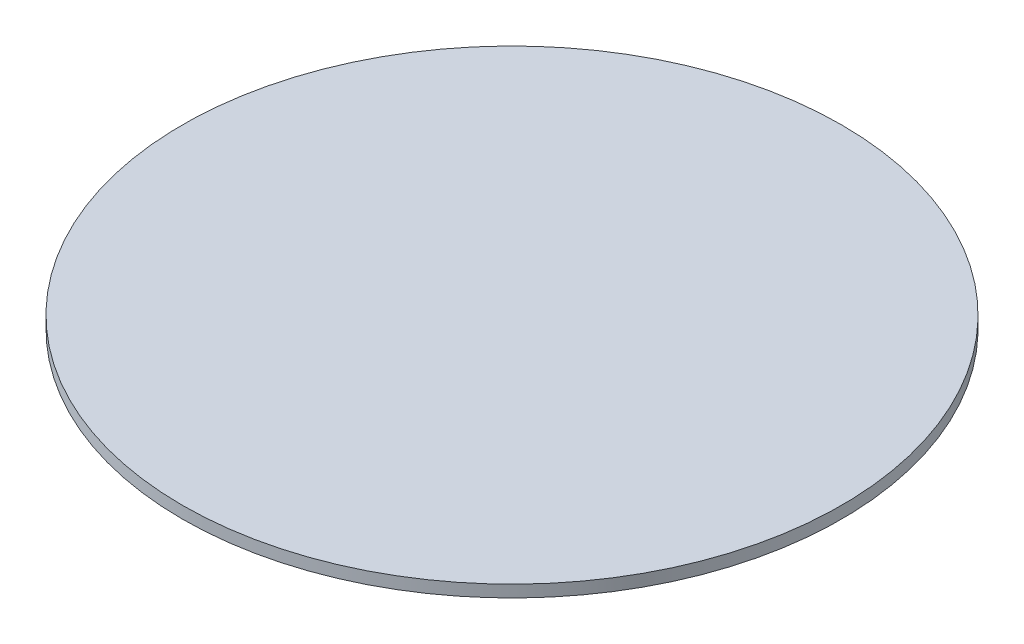
ISO-10303-21;
HEADER;
FILE_DESCRIPTION(('STEP AP214'),'2;1');
FILE_NAME('part.step','',(''),(''),'','','');
FILE_SCHEMA(('AUTOMOTIVE_DESIGN { 1 0 10303 214 1 1 1 1 }'));
ENDSEC;
DATA;
#1=APPLICATION_CONTEXT('core data for automotive mechanical design processes');
#2=APPLICATION_PROTOCOL_DEFINITION('international standard','automotive_design',2000,#1);
#3=PRODUCT_CONTEXT('',#1,'mechanical');
#4=PRODUCT('Part','Part','',(#3));
#5=PRODUCT_RELATED_PRODUCT_CATEGORY('part','',(#4));
#6=PRODUCT_DEFINITION_FORMATION('','',#4);
#7=PRODUCT_DEFINITION_CONTEXT('part definition',#1,'design');
#8=PRODUCT_DEFINITION('design','',#6,#7);
#9=PRODUCT_DEFINITION_SHAPE('','',#8);
#10=(LENGTH_UNIT() NAMED_UNIT(*) SI_UNIT(.MILLI.,.METRE.));
#11=(NAMED_UNIT(*) PLANE_ANGLE_UNIT() SI_UNIT($,.RADIAN.));
#12=(NAMED_UNIT(*) SI_UNIT($,.STERADIAN.) SOLID_ANGLE_UNIT());
#13=UNCERTAINTY_MEASURE_WITH_UNIT(LENGTH_MEASURE(1.E-05),#10,'distance_accuracy_value','');
#14=(GEOMETRIC_REPRESENTATION_CONTEXT(3) GLOBAL_UNCERTAINTY_ASSIGNED_CONTEXT((#13)) GLOBAL_UNIT_ASSIGNED_CONTEXT((#10,
#11,#12)) REPRESENTATION_CONTEXT('',''));
#15=CARTESIAN_POINT('',(0.,0.,0.));
#16=DIRECTION('',(0.,0.,1.));
#17=DIRECTION('',(1.,0.,0.));
#18=AXIS2_PLACEMENT_3D('',#15,#16,#17);
#19=CARTESIAN_POINT('',(350.,878.,-300.));
#20=DIRECTION('',(0.,-1.,0.));
#21=DIRECTION('',(0.,0.,-1.));
#22=AXIS2_PLACEMENT_3D('',#19,#20,#21);
#23=CYLINDRICAL_SURFACE('',#22,165.);
#24=CARTESIAN_POINT('',(350.,878.,-300.));
#25=DIRECTION('',(0.,1.,0.));
#26=DIRECTION('',(0.,0.,1.));
#27=AXIS2_PLACEMENT_3D('',#24,#25,#26);
#28=CIRCLE('',#27,165.);
#29=CARTESIAN_POINT('',(350.,878.,-135.));
#30=VERTEX_POINT('',#29);
#31=EDGE_CURVE('E10',#30,#30,#28,.T.);
#32=ORIENTED_EDGE('',*,*,#31,.F.);
#33=EDGE_LOOP('',(#32));
#34=FACE_BOUND('',#33,.T.);
#35=CARTESIAN_POINT('',(350.,872.,-300.));
#36=DIRECTION('',(0.,1.,0.));
#37=DIRECTION('',(0.,0.,1.));
#38=AXIS2_PLACEMENT_3D('',#35,#36,#37);
#39=CIRCLE('',#38,165.);
#40=CARTESIAN_POINT('',(350.,872.,-135.));
#41=VERTEX_POINT('',#40);
#42=EDGE_CURVE('E40',#41,#41,#39,.T.);
#43=ORIENTED_EDGE('',*,*,#42,.T.);
#44=EDGE_LOOP('',(#43));
#45=FACE_BOUND('',#44,.T.);
#46=ADVANCED_FACE('F37',(#34,#45),#23,.T.);
#47=CARTESIAN_POINT('',(350.,878.,-300.));
#48=DIRECTION('',(0.,1.,0.));
#49=DIRECTION('',(0.,0.,1.));
#50=AXIS2_PLACEMENT_3D('',#47,#48,#49);
#51=PLANE('',#50);
#52=ORIENTED_EDGE('',*,*,#31,.T.);
#53=EDGE_LOOP('',(#52));
#54=FACE_BOUND('',#53,.T.);
#55=ADVANCED_FACE('F52',(#54),#51,.T.);
#56=CARTESIAN_POINT('',(350.,872.,-300.));
#57=DIRECTION('',(0.,1.,0.));
#58=DIRECTION('',(0.,0.,1.));
#59=AXIS2_PLACEMENT_3D('',#56,#57,#58);
#60=PLANE('',#59);
#61=ORIENTED_EDGE('',*,*,#42,.F.);
#62=EDGE_LOOP('',(#61));
#63=FACE_BOUND('',#62,.T.);
#64=ADVANCED_FACE('F50',(#63),#60,.F.);
#65=CLOSED_SHELL('',(#46,#55,#64));
#66=MANIFOLD_SOLID_BREP('B2',#65);
#67=ADVANCED_BREP_SHAPE_REPRESENTATION('',(#18,#66),#14);
#68=SHAPE_DEFINITION_REPRESENTATION(#9,#67);
ENDSEC;
END-ISO-10303-21;
